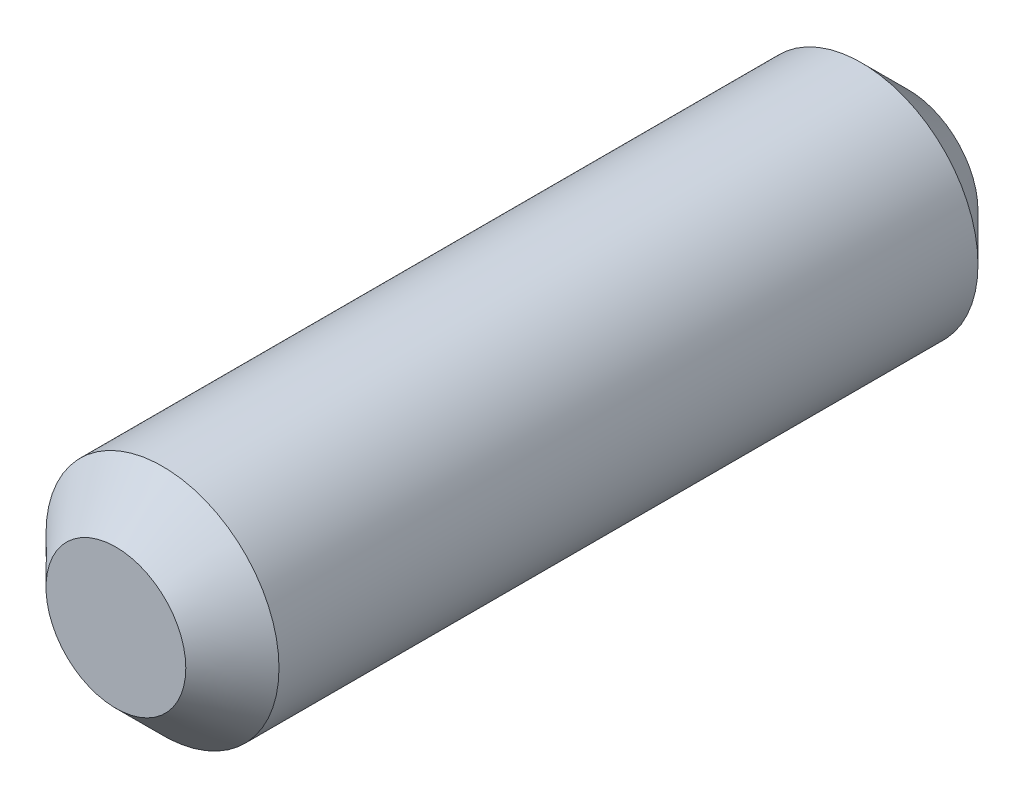
ISO-10303-21;
HEADER;
FILE_DESCRIPTION(('STEP AP214'),'2;1');
FILE_NAME('part.step','',(''),(''),'','','');
FILE_SCHEMA(('AUTOMOTIVE_DESIGN { 1 0 10303 214 1 1 1 1 }'));
ENDSEC;
DATA;
#1=APPLICATION_CONTEXT('core data for automotive mechanical design processes');
#2=APPLICATION_PROTOCOL_DEFINITION('international standard','automotive_design',2000,#1);
#3=PRODUCT_CONTEXT('',#1,'mechanical');
#4=PRODUCT('Part','Part','',(#3));
#5=PRODUCT_RELATED_PRODUCT_CATEGORY('part','',(#4));
#6=PRODUCT_DEFINITION_FORMATION('','',#4);
#7=PRODUCT_DEFINITION_CONTEXT('part definition',#1,'design');
#8=PRODUCT_DEFINITION('design','',#6,#7);
#9=PRODUCT_DEFINITION_SHAPE('','',#8);
#10=(LENGTH_UNIT() NAMED_UNIT(*) SI_UNIT(.MILLI.,.METRE.));
#11=(NAMED_UNIT(*) PLANE_ANGLE_UNIT() SI_UNIT($,.RADIAN.));
#12=(NAMED_UNIT(*) SI_UNIT($,.STERADIAN.) SOLID_ANGLE_UNIT());
#13=UNCERTAINTY_MEASURE_WITH_UNIT(LENGTH_MEASURE(1.E-05),#10,'distance_accuracy_value','');
#14=(GEOMETRIC_REPRESENTATION_CONTEXT(3) GLOBAL_UNCERTAINTY_ASSIGNED_CONTEXT((#13)) GLOBAL_UNIT_ASSIGNED_CONTEXT((#10,
#11,#12)) REPRESENTATION_CONTEXT('',''));
#15=CARTESIAN_POINT('',(0.,0.,0.));
#16=DIRECTION('',(0.,0.,1.));
#17=DIRECTION('',(1.,0.,0.));
#18=AXIS2_PLACEMENT_3D('',#15,#16,#17);
#19=CARTESIAN_POINT('',(0.,0.,8.5));
#20=DIRECTION('',(0.,0.,-1.));
#21=DIRECTION('',(-1.,0.,0.));
#22=AXIS2_PLACEMENT_3D('',#19,#20,#21);
#23=CYLINDRICAL_SURFACE('',#22,2.5);
#24=CARTESIAN_POINT('',(0.,0.,-7.50000000000001));
#25=DIRECTION('',(0.,0.,1.));
#26=DIRECTION('',(1.,0.,0.));
#27=AXIS2_PLACEMENT_3D('',#24,#25,#26);
#28=CIRCLE('',#27,2.5);
#29=CARTESIAN_POINT('',(2.5,0.,-7.50000000000001));
#30=VERTEX_POINT('',#29);
#31=EDGE_CURVE('E57',#30,#30,#28,.T.);
#32=ORIENTED_EDGE('',*,*,#31,.T.);
#33=EDGE_LOOP('',(#32));
#34=FACE_BOUND('',#33,.T.);
#35=CARTESIAN_POINT('',(0.,0.,7.5));
#36=DIRECTION('',(0.,0.,1.));
#37=DIRECTION('',(1.,0.,0.));
#38=AXIS2_PLACEMENT_3D('',#35,#36,#37);
#39=CIRCLE('',#38,2.5);
#40=CARTESIAN_POINT('',(2.5,0.,7.5));
#41=VERTEX_POINT('',#40);
#42=EDGE_CURVE('E62',#41,#41,#39,.F.);
#43=ORIENTED_EDGE('',*,*,#42,.T.);
#44=EDGE_LOOP('',(#43));
#45=FACE_BOUND('',#44,.T.);
#46=ADVANCED_FACE('F43',(#34,#45),#23,.T.);
#47=CARTESIAN_POINT('',(0.,0.,8.5));
#48=DIRECTION('',(0.,0.,1.));
#49=DIRECTION('',(1.,0.,0.));
#50=AXIS2_PLACEMENT_3D('',#47,#48,#49);
#51=PLANE('',#50);
#52=CARTESIAN_POINT('',(0.,0.,8.5));
#53=DIRECTION('',(0.,0.,1.));
#54=DIRECTION('',(1.,0.,0.));
#55=AXIS2_PLACEMENT_3D('',#52,#53,#54);
#56=CIRCLE('',#55,1.5);
#57=CARTESIAN_POINT('',(1.5,0.,8.5));
#58=VERTEX_POINT('',#57);
#59=EDGE_CURVE('E10',#58,#58,#56,.T.);
#60=ORIENTED_EDGE('',*,*,#59,.T.);
#61=EDGE_LOOP('',(#60));
#62=FACE_BOUND('',#61,.T.);
#63=ADVANCED_FACE('F79',(#62),#51,.T.);
#64=CARTESIAN_POINT('',(0.,0.,-8.5));
#65=DIRECTION('',(0.,0.,1.));
#66=DIRECTION('',(1.,0.,0.));
#67=AXIS2_PLACEMENT_3D('',#64,#65,#66);
#68=PLANE('',#67);
#69=CARTESIAN_POINT('',(0.,0.,-8.5));
#70=DIRECTION('',(0.,0.,1.));
#71=DIRECTION('',(1.,0.,0.));
#72=AXIS2_PLACEMENT_3D('',#69,#70,#71);
#73=CIRCLE('',#72,1.5);
#74=CARTESIAN_POINT('',(1.5,0.,-8.5));
#75=VERTEX_POINT('',#74);
#76=EDGE_CURVE('E52',#75,#75,#73,.F.);
#77=ORIENTED_EDGE('',*,*,#76,.T.);
#78=EDGE_LOOP('',(#77));
#79=FACE_BOUND('',#78,.T.);
#80=ADVANCED_FACE('F76',(#79),#68,.F.);
#81=CARTESIAN_POINT('',(0.,0.,-7.50000000000001));
#82=DIRECTION('',(0.,0.,1.));
#83=DIRECTION('',(1.,0.,0.));
#84=AXIS2_PLACEMENT_3D('',#81,#82,#83);
#85=CONICAL_SURFACE('',#84,2.5,0.785398163397451);
#86=ORIENTED_EDGE('',*,*,#76,.F.);
#87=EDGE_LOOP('',(#86));
#88=FACE_BOUND('',#87,.T.);
#89=ORIENTED_EDGE('',*,*,#31,.F.);
#90=EDGE_LOOP('',(#89));
#91=FACE_BOUND('',#90,.T.);
#92=ADVANCED_FACE('F72',(#88,#91),#85,.T.);
#93=CARTESIAN_POINT('',(0.,0.,8.5));
#94=DIRECTION('',(0.,0.,-1.));
#95=DIRECTION('',(-1.,0.,0.));
#96=AXIS2_PLACEMENT_3D('',#93,#94,#95);
#97=CONICAL_SURFACE('',#96,1.5,0.785398163397447);
#98=ORIENTED_EDGE('',*,*,#42,.F.);
#99=EDGE_LOOP('',(#98));
#100=FACE_BOUND('',#99,.T.);
#101=ORIENTED_EDGE('',*,*,#59,.F.);
#102=EDGE_LOOP('',(#101));
#103=FACE_BOUND('',#102,.T.);
#104=ADVANCED_FACE('F46',(#100,#103),#97,.T.);
#105=CLOSED_SHELL('',(#46,#63,#80,#92,#104));
#106=MANIFOLD_SOLID_BREP('B2',#105);
#107=ADVANCED_BREP_SHAPE_REPRESENTATION('',(#18,#106),#14);
#108=SHAPE_DEFINITION_REPRESENTATION(#9,#107);
ENDSEC;
END-ISO-10303-21;
